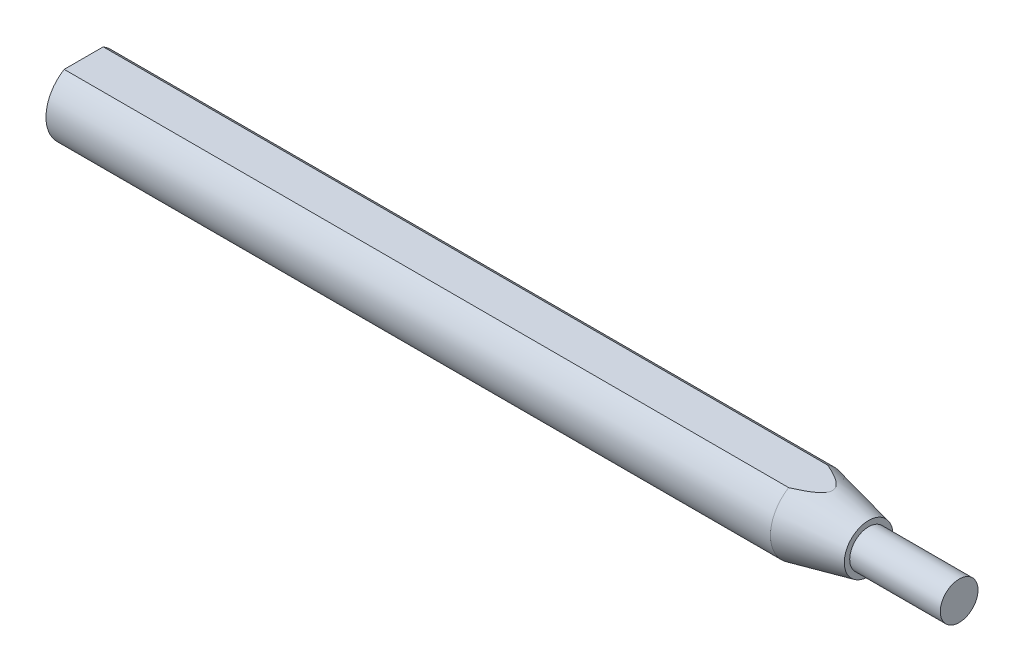
ISO-10303-21;
HEADER;
FILE_DESCRIPTION(('STEP AP214'),'2;1');
FILE_NAME('part.step','',(''),(''),'','','');
FILE_SCHEMA(('AUTOMOTIVE_DESIGN { 1 0 10303 214 1 1 1 1 }'));
ENDSEC;
DATA;
#1=APPLICATION_CONTEXT('core data for automotive mechanical design processes');
#2=APPLICATION_PROTOCOL_DEFINITION('international standard','automotive_design',2000,#1);
#3=PRODUCT_CONTEXT('',#1,'mechanical');
#4=PRODUCT('Part','Part','',(#3));
#5=PRODUCT_RELATED_PRODUCT_CATEGORY('part','',(#4));
#6=PRODUCT_DEFINITION_FORMATION('','',#4);
#7=PRODUCT_DEFINITION_CONTEXT('part definition',#1,'design');
#8=PRODUCT_DEFINITION('design','',#6,#7);
#9=PRODUCT_DEFINITION_SHAPE('','',#8);
#10=(LENGTH_UNIT() NAMED_UNIT(*) SI_UNIT(.MILLI.,.METRE.));
#11=(NAMED_UNIT(*) PLANE_ANGLE_UNIT() SI_UNIT($,.RADIAN.));
#12=(NAMED_UNIT(*) SI_UNIT($,.STERADIAN.) SOLID_ANGLE_UNIT());
#13=UNCERTAINTY_MEASURE_WITH_UNIT(LENGTH_MEASURE(1.E-05),#10,'distance_accuracy_value','');
#14=(GEOMETRIC_REPRESENTATION_CONTEXT(3) GLOBAL_UNCERTAINTY_ASSIGNED_CONTEXT((#13)) GLOBAL_UNIT_ASSIGNED_CONTEXT((#10,
#11,#12)) REPRESENTATION_CONTEXT('',''));
#15=CARTESIAN_POINT('',(0.,0.,0.));
#16=DIRECTION('',(0.,0.,1.));
#17=DIRECTION('',(1.,0.,0.));
#18=AXIS2_PLACEMENT_3D('',#15,#16,#17);
#19=CARTESIAN_POINT('',(60.96,0.,0.));
#20=DIRECTION('',(-1.,0.,0.));
#21=DIRECTION('',(0.,0.,1.));
#22=AXIS2_PLACEMENT_3D('',#19,#20,#21);
#23=CYLINDRICAL_SURFACE('',#22,3.175);
#24=CARTESIAN_POINT('',(60.96,0.,0.));
#25=DIRECTION('',(1.,0.,0.));
#26=DIRECTION('',(0.,0.,-1.));
#27=AXIS2_PLACEMENT_3D('',#24,#25,#26);
#28=CIRCLE('',#27,3.175);
#29=CARTESIAN_POINT('',(60.96,2.7178,1.6413982332146));
#30=VERTEX_POINT('',#29);
#31=CARTESIAN_POINT('',(60.96,2.7178,-1.6413982332146));
#32=VERTEX_POINT('',#31);
#33=EDGE_CURVE('E54',#30,#32,#28,.T.);
#34=ORIENTED_EDGE('',*,*,#33,.F.);
#35=DIRECTION('',(-1.,0.,0.));
#36=VECTOR('',#35,1.);
#37=CARTESIAN_POINT('',(73.66,2.7178,1.6413982332146));
#38=LINE('',#37,#36);
#39=CARTESIAN_POINT('',(0.,2.7178,1.6413982332146));
#40=VERTEX_POINT('',#39);
#41=EDGE_CURVE('E60',#30,#40,#38,.T.);
#42=ORIENTED_EDGE('',*,*,#41,.T.);
#43=CARTESIAN_POINT('',(0.,0.,0.));
#44=DIRECTION('',(1.,0.,0.));
#45=DIRECTION('',(0.,0.,-1.));
#46=AXIS2_PLACEMENT_3D('',#43,#44,#45);
#47=CIRCLE('',#46,3.175);
#48=CARTESIAN_POINT('',(0.,2.7178,-1.6413982332146));
#49=VERTEX_POINT('',#48);
#50=EDGE_CURVE('E80',#40,#49,#47,.T.);
#51=ORIENTED_EDGE('',*,*,#50,.T.);
#52=DIRECTION('',(-1.,0.,0.));
#53=VECTOR('',#52,1.);
#54=CARTESIAN_POINT('',(73.66,2.7178,-1.6413982332146));
#55=LINE('',#54,#53);
#56=EDGE_CURVE('E68',#32,#49,#55,.T.);
#57=ORIENTED_EDGE('',*,*,#56,.F.);
#58=EDGE_LOOP('',(#34,#42,#51,#57));
#59=FACE_BOUND('',#58,.T.);
#60=ADVANCED_FACE('F41',(#59),#23,.T.);
#61=CARTESIAN_POINT('',(0.,0.,0.));
#62=DIRECTION('',(1.,0.,0.));
#63=DIRECTION('',(0.,0.,-1.));
#64=AXIS2_PLACEMENT_3D('',#61,#62,#63);
#65=PLANE('',#64);
#66=ORIENTED_EDGE('',*,*,#50,.F.);
#67=DIRECTION('',(0.,0.,1.));
#68=VECTOR('',#67,1.);
#69=CARTESIAN_POINT('',(0.,2.7178,1.6413982332146));
#70=LINE('',#69,#68);
#71=EDGE_CURVE('E71',#49,#40,#70,.T.);
#72=ORIENTED_EDGE('',*,*,#71,.F.);
#73=EDGE_LOOP('',(#66,#72));
#74=FACE_BOUND('',#73,.T.);
#75=ADVANCED_FACE('F79',(#74),#65,.F.);
#76=CARTESIAN_POINT('',(66.04,-1.5875,0.));
#77=DIRECTION('',(1.,0.,0.));
#78=DIRECTION('',(0.,0.,-1.));
#79=AXIS2_PLACEMENT_3D('',#76,#77,#78);
#80=PLANE('',#79);
#81=CARTESIAN_POINT('',(66.04,0.,0.));
#82=DIRECTION('',(-1.,0.,0.));
#83=DIRECTION('',(0.,0.,1.));
#84=AXIS2_PLACEMENT_3D('',#81,#82,#83);
#85=CIRCLE('',#84,1.5875);
#86=CARTESIAN_POINT('',(66.04,0.,1.5875));
#87=VERTEX_POINT('',#86);
#88=EDGE_CURVE('E85',#87,#87,#85,.T.);
#89=ORIENTED_EDGE('',*,*,#88,.T.);
#90=EDGE_LOOP('',(#89));
#91=FACE_BOUND('',#90,.T.);
#92=CARTESIAN_POINT('',(66.04,0.,0.));
#93=DIRECTION('',(-1.,0.,0.));
#94=DIRECTION('',(0.,0.,1.));
#95=AXIS2_PLACEMENT_3D('',#92,#93,#94);
#96=CIRCLE('',#95,2.0447);
#97=CARTESIAN_POINT('',(66.04,0.,2.0447));
#98=VERTEX_POINT('',#97);
#99=EDGE_CURVE('E90',#98,#98,#96,.T.);
#100=ORIENTED_EDGE('',*,*,#99,.F.);
#101=EDGE_LOOP('',(#100));
#102=FACE_BOUND('',#101,.T.);
#103=ADVANCED_FACE('F97',(#91,#102),#80,.T.);
#104=CARTESIAN_POINT('',(60.96,0.,0.));
#105=DIRECTION('',(-1.,0.,0.));
#106=DIRECTION('',(0.,0.,1.));
#107=AXIS2_PLACEMENT_3D('',#104,#105,#106);
#108=CONICAL_SURFACE('',#107,3.175,0.218933636180095);
#109=CARTESIAN_POINT('',(54.9113991667218,2.7178,3.61266100515115));
#110=CARTESIAN_POINT('',(55.1802506860928,2.7178,3.53778420648059));
#111=CARTESIAN_POINT('',(55.4488973558206,2.7178,3.46216167272926));
#112=CARTESIAN_POINT('',(55.9857495872434,2.7178,3.30899674602571));
#113=CARTESIAN_POINT('',(56.253954949474,2.7178,3.23145365460283));
#114=CARTESIAN_POINT('',(56.7930022223642,2.7178,3.07310222298478));
#115=CARTESIAN_POINT('',(57.0638357933426,2.7178,2.99226538616568));
#116=CARTESIAN_POINT('',(57.6045136447964,2.7178,2.82765398261167));
#117=CARTESIAN_POINT('',(57.8743582160341,2.7178,2.74388037127798));
#118=CARTESIAN_POINT('',(58.4691231188758,2.7178,2.5546388290635));
#119=CARTESIAN_POINT('',(58.7937682763795,2.7178,2.44829585291562));
#120=CARTESIAN_POINT('',(59.2788882274572,2.7178,2.28276816925549));
#121=CARTESIAN_POINT('',(59.4403770761863,2.7178,2.22655681437068));
#122=CARTESIAN_POINT('',(59.7624691028983,2.7178,2.11167450456055));
#123=CARTESIAN_POINT('',(59.9230723397797,2.7178,2.05300371548994));
#124=CARTESIAN_POINT('',(60.2420363524328,2.7178,1.93298404760233));
#125=CARTESIAN_POINT('',(60.4004049495858,2.7178,1.87165603236171));
#126=CARTESIAN_POINT('',(60.7155635374247,2.7178,1.74507575572777));
#127=CARTESIAN_POINT('',(60.8723536711382,2.7178,1.6798238536906));
#128=CARTESIAN_POINT('',(61.1833749030938,2.7178,1.54416895618573));
#129=CARTESIAN_POINT('',(61.3376099709996,2.7178,1.47377509885384));
#130=CARTESIAN_POINT('',(61.6424951777903,2.7178,1.32565282497037));
#131=CARTESIAN_POINT('',(61.7931476734906,2.7178,1.24792940729862));
#132=CARTESIAN_POINT('',(61.9747501205227,2.7178,1.14531870228522));
#133=CARTESIAN_POINT('',(62.0087014936039,2.7178,1.12573910046447));
#134=CARTESIAN_POINT('',(62.0762005865453,2.7178,1.08589073721433));
#135=CARTESIAN_POINT('',(62.1097482724697,2.7178,1.06562191838657));
#136=CARTESIAN_POINT('',(62.2097424001361,2.7178,1.00363025431802));
#137=CARTESIAN_POINT('',(62.2754847786312,2.7178,0.960752972855771));
#138=CARTESIAN_POINT('',(62.4036357715088,2.7178,0.871471456444728));
#139=CARTESIAN_POINT('',(62.4660699576303,2.7178,0.825104253117504));
#140=CARTESIAN_POINT('',(62.5867917451168,2.7178,0.727301529488775));
#141=CARTESIAN_POINT('',(62.6450855880219,2.7178,0.675873929457967));
#142=CARTESIAN_POINT('',(62.7452954851992,2.7178,0.575781664012085));
#143=CARTESIAN_POINT('',(62.7882908146034,2.7178,0.528214444095403));
#144=CARTESIAN_POINT('',(62.8668003391761,2.7178,0.427283301662324));
#145=CARTESIAN_POINT('',(62.9023452684502,2.7178,0.373944626858379));
#146=CARTESIAN_POINT('',(62.9493554068525,2.7178,0.283745286786959));
#147=CARTESIAN_POINT('',(62.9647430950944,2.7178,0.248957352833741));
#148=CARTESIAN_POINT('',(62.9898913702192,2.7178,0.177376638749455));
#149=CARTESIAN_POINT('',(62.9996571376661,2.7178,0.140585738676065));
#150=CARTESIAN_POINT('',(63.0124563177278,2.7178,0.0654837968755482));
#151=CARTESIAN_POINT('',(63.0154312261842,2.7178,0.027162417960368));
#152=CARTESIAN_POINT('',(63.014028301335,2.7178,-0.0493430331479325));
#153=CARTESIAN_POINT('',(63.0096504139535,2.7178,-0.0875271043291583));
#154=CARTESIAN_POINT('',(62.994954704607,2.7178,-0.158753713149017));
#155=CARTESIAN_POINT('',(62.9852658020683,2.7178,-0.191931742812767));
#156=CARTESIAN_POINT('',(62.961368166987,2.7178,-0.256593847078705));
#157=CARTESIAN_POINT('',(62.9471572936994,2.7178,-0.28807711109203));
#158=CARTESIAN_POINT('',(62.902135105847,2.7178,-0.374132650341111));
#159=CARTESIAN_POINT('',(62.8672471293473,2.7178,-0.426552643361974));
#160=CARTESIAN_POINT('',(62.7902718437947,2.7178,-0.525820004974327));
#161=CARTESIAN_POINT('',(62.748156502613,2.7178,-0.57264442350298));
#162=CARTESIAN_POINT('',(62.6394970285656,2.7178,-0.681834042528013));
#163=CARTESIAN_POINT('',(62.570488178867,2.7178,-0.741710881455837));
#164=CARTESIAN_POINT('',(62.4271713779573,2.7178,-0.854841238707066));
#165=CARTESIAN_POINT('',(62.3528511410624,2.7178,-0.908078564390487));
#166=CARTESIAN_POINT('',(62.2004991939979,2.7178,-1.00995838003253));
#167=CARTESIAN_POINT('',(62.1224476099433,2.7178,-1.05857086174048));
#168=CARTESIAN_POINT('',(61.9642572070878,2.7178,-1.15199446062929));
#169=CARTESIAN_POINT('',(61.8841210288747,2.7178,-1.19681010751528));
#170=CARTESIAN_POINT('',(61.712547400834,2.7178,-1.2887687997448));
#171=CARTESIAN_POINT('',(61.6209122758988,2.7178,-1.33554100101704));
#172=CARTESIAN_POINT('',(61.4362411050596,2.7178,-1.42624445308456));
#173=CARTESIAN_POINT('',(61.3432048527619,2.7178,-1.47017528018222));
#174=CARTESIAN_POINT('',(61.0624493302923,2.7178,-1.5986249780649));
#175=CARTESIAN_POINT('',(60.8731806314291,2.7178,-1.67975072012937));
#176=CARTESIAN_POINT('',(60.4917103602081,2.7178,-1.8360147577888));
#177=CARTESIAN_POINT('',(60.2995029193441,2.7178,-1.91113846781163));
#178=CARTESIAN_POINT('',(59.9134427114479,2.7178,-2.05682378799781));
#179=CARTESIAN_POINT('',(59.7195904792889,2.7178,-2.12738682143787));
#180=CARTESIAN_POINT('',(59.3308216863093,2.7178,-2.2650101788078));
#181=CARTESIAN_POINT('',(59.1359060600711,2.7178,-2.33207315827196));
#182=CARTESIAN_POINT('',(58.7451495913571,2.7178,-2.46348714590478));
#183=CARTESIAN_POINT('',(58.5493086795168,2.7178,-2.5278379470478));
#184=CARTESIAN_POINT('',(57.9612079548137,2.7178,-2.71748578161622));
#185=CARTESIAN_POINT('',(57.5679026278833,2.7178,-2.83954049601458));
#186=CARTESIAN_POINT('',(56.9856001295028,2.7178,-3.01545296024604));
#187=CARTESIAN_POINT('',(56.7972858396577,2.7178,-3.07160495922094));
#188=CARTESIAN_POINT('',(56.420261317439,2.7178,-3.18274952796318));
#189=CARTESIAN_POINT('',(56.2315509951544,2.7178,-3.23774179369437));
#190=CARTESIAN_POINT('',(55.8543825939437,2.7178,-3.34656218806482));
#191=CARTESIAN_POINT('',(55.6659253464885,2.7178,-3.40039320585423));
#192=CARTESIAN_POINT('',(55.2888132862211,2.7178,-3.50716213807287));
#193=CARTESIAN_POINT('',(55.1001585410758,2.7178,-3.56010029140449));
#194=CARTESIAN_POINT('',(54.9113991667218,2.7178,-3.61266100515114));
#195=B_SPLINE_CURVE_WITH_KNOTS('',3,(#109,#110,#111,#112,#113,#114,#115,#116,#117,#118,#119,
#120,#121,#122,#123,#124,#125,#126,#127,#128,#129,#130,#131,#132,#133,#134,#135,#136,#137,#138,
#139,#140,#141,#142,#143,#144,#145,#146,#147,#148,#149,#150,#151,#152,#153,#154,#155,#156,#157,
#158,#159,#160,#161,#162,#163,#164,#165,#166,#167,#168,#169,#170,#171,#172,#173,#174,#175,#176,
#177,#178,#179,#180,#181,#182,#183,#184,#185,#186,#187,#188,#189,#190,#191,#192,#193,#194),
.UNSPECIFIED.,.F.,.F.,(4,2,2,2,2,2,2,2,2,2,2,2,2,2,2,2,2,2,2,2,2,2,2,2,2,2,2,2,2,2,2,2,2,2,2,2,
2,2,2,2,2,2,4),(0.,0.837253760692967,1.67481662049972,2.52272205880566,3.37035416791187,
4.39512563340433,4.90808778867205,5.42101540723697,5.93046402910512,6.43986606565773,
6.94838385717044,7.45655730550455,7.57412774593043,7.69170800178459,7.92705778215803,
8.16019040775386,8.39296378103237,8.58491044331127,8.77604899439697,8.88979467945235,
9.00343538010975,9.11805147427088,9.23266841137557,9.33597265912474,9.43932588505331,
9.62712333269248,9.81566635368343,10.0890520947092,10.3630920538315,10.638803593574,
10.9141814304741,11.2227605289518,11.5313855362782,12.1489639048394,12.7680000841368,
13.3868421350279,14.0052076256154,14.6236202320269,15.8589611848536,16.4484835809301,
17.0381586520279,17.6261406311113,18.2139627057043),.UNSPECIFIED.);
#196=EDGE_CURVE('E11',#30,#32,#195,.T.);
#197=ORIENTED_EDGE('',*,*,#196,.F.);
#198=ORIENTED_EDGE('',*,*,#33,.T.);
#199=EDGE_LOOP('',(#197,#198));
#200=FACE_BOUND('',#199,.T.);
#201=ORIENTED_EDGE('',*,*,#99,.T.);
#202=EDGE_LOOP('',(#201));
#203=FACE_BOUND('',#202,.T.);
#204=ADVANCED_FACE('F95',(#200,#203),#108,.T.);
#205=CARTESIAN_POINT('',(73.66,0.,0.));
#206=DIRECTION('',(1.,0.,0.));
#207=DIRECTION('',(0.,0.,-1.));
#208=AXIS2_PLACEMENT_3D('',#205,#206,#207);
#209=PLANE('',#208);
#210=CARTESIAN_POINT('',(73.66,0.,0.));
#211=DIRECTION('',(1.,0.,0.));
#212=DIRECTION('',(0.,0.,-1.));
#213=AXIS2_PLACEMENT_3D('',#210,#211,#212);
#214=CIRCLE('',#213,1.5875);
#215=CARTESIAN_POINT('',(73.66,0.,-1.5875));
#216=VERTEX_POINT('',#215);
#217=EDGE_CURVE('E82',#216,#216,#214,.T.);
#218=ORIENTED_EDGE('',*,*,#217,.T.);
#219=EDGE_LOOP('',(#218));
#220=FACE_BOUND('',#219,.T.);
#221=ADVANCED_FACE('F105',(#220),#209,.T.);
#222=CARTESIAN_POINT('',(73.66,0.,0.));
#223=DIRECTION('',(-1.,0.,0.));
#224=DIRECTION('',(0.,0.,1.));
#225=AXIS2_PLACEMENT_3D('',#222,#223,#224);
#226=CYLINDRICAL_SURFACE('',#225,1.5875);
#227=ORIENTED_EDGE('',*,*,#88,.F.);
#228=EDGE_LOOP('',(#227));
#229=FACE_BOUND('',#228,.T.);
#230=ORIENTED_EDGE('',*,*,#217,.F.);
#231=EDGE_LOOP('',(#230));
#232=FACE_BOUND('',#231,.T.);
#233=ADVANCED_FACE('F135',(#229,#232),#226,.T.);
#234=CARTESIAN_POINT('',(73.66,2.7178,1.6413982332146));
#235=DIRECTION('',(0.,-1.,0.));
#236=DIRECTION('',(0.,0.,-1.));
#237=AXIS2_PLACEMENT_3D('',#234,#235,#236);
#238=PLANE('',#237);
#239=ORIENTED_EDGE('',*,*,#196,.T.);
#240=ORIENTED_EDGE('',*,*,#56,.T.);
#241=ORIENTED_EDGE('',*,*,#71,.T.);
#242=ORIENTED_EDGE('',*,*,#41,.F.);
#243=EDGE_LOOP('',(#239,#240,#241,#242));
#244=FACE_BOUND('',#243,.T.);
#245=ADVANCED_FACE('F70',(#244),#238,.F.);
#246=CLOSED_SHELL('',(#60,#75,#103,#204,#221,#233,#245));
#247=MANIFOLD_SOLID_BREP('B2',#246);
#248=ADVANCED_BREP_SHAPE_REPRESENTATION('',(#18,#247),#14);
#249=SHAPE_DEFINITION_REPRESENTATION(#9,#248);
ENDSEC;
END-ISO-10303-21;
